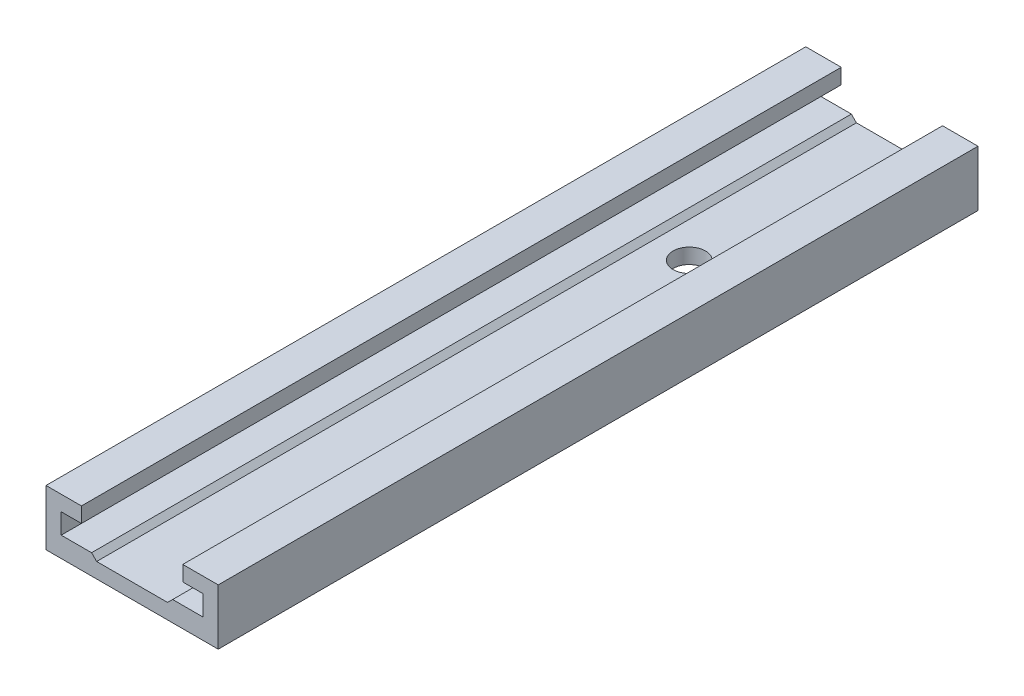
ISO-10303-21;
HEADER;
FILE_DESCRIPTION(('STEP AP214'),'2;1');
FILE_NAME('part.step','',(''),(''),'','','');
FILE_SCHEMA(('AUTOMOTIVE_DESIGN { 1 0 10303 214 1 1 1 1 }'));
ENDSEC;
DATA;
#1=APPLICATION_CONTEXT('core data for automotive mechanical design processes');
#2=APPLICATION_PROTOCOL_DEFINITION('international standard','automotive_design',2000,#1);
#3=PRODUCT_CONTEXT('',#1,'mechanical');
#4=PRODUCT('Part','Part','',(#3));
#5=PRODUCT_RELATED_PRODUCT_CATEGORY('part','',(#4));
#6=PRODUCT_DEFINITION_FORMATION('','',#4);
#7=PRODUCT_DEFINITION_CONTEXT('part definition',#1,'design');
#8=PRODUCT_DEFINITION('design','',#6,#7);
#9=PRODUCT_DEFINITION_SHAPE('','',#8);
#10=(LENGTH_UNIT() NAMED_UNIT(*) SI_UNIT(.MILLI.,.METRE.));
#11=(NAMED_UNIT(*) PLANE_ANGLE_UNIT() SI_UNIT($,.RADIAN.));
#12=(NAMED_UNIT(*) SI_UNIT($,.STERADIAN.) SOLID_ANGLE_UNIT());
#13=UNCERTAINTY_MEASURE_WITH_UNIT(LENGTH_MEASURE(1.E-05),#10,'distance_accuracy_value','');
#14=(GEOMETRIC_REPRESENTATION_CONTEXT(3) GLOBAL_UNCERTAINTY_ASSIGNED_CONTEXT((#13)) GLOBAL_UNIT_ASSIGNED_CONTEXT((#10,
#11,#12)) REPRESENTATION_CONTEXT('',''));
#15=CARTESIAN_POINT('',(0.,0.,0.));
#16=DIRECTION('',(0.,0.,1.));
#17=DIRECTION('',(1.,0.,0.));
#18=AXIS2_PLACEMENT_3D('',#15,#16,#17);
#19=CARTESIAN_POINT('',(-8.5,5.5,75.));
#20=DIRECTION('',(1.,0.,0.));
#21=DIRECTION('',(0.,0.,-1.));
#22=AXIS2_PLACEMENT_3D('',#19,#20,#21);
#23=PLANE('',#22);
#24=DIRECTION('',(0.,-1.,0.));
#25=VECTOR('',#24,1.);
#26=CARTESIAN_POINT('',(-8.5,5.5,0.));
#27=LINE('',#26,#25);
#28=CARTESIAN_POINT('',(-8.5,5.5,0.));
#29=VERTEX_POINT('',#28);
#30=CARTESIAN_POINT('',(-8.5,0.,0.));
#31=VERTEX_POINT('',#30);
#32=EDGE_CURVE('E177',#29,#31,#27,.T.);
#33=ORIENTED_EDGE('',*,*,#32,.T.);
#34=DIRECTION('',(0.,0.,-1.));
#35=VECTOR('',#34,1.);
#36=CARTESIAN_POINT('',(-8.5,0.,75.));
#37=LINE('',#36,#35);
#38=CARTESIAN_POINT('',(-8.5,0.,75.));
#39=VERTEX_POINT('',#38);
#40=EDGE_CURVE('E11',#39,#31,#37,.T.);
#41=ORIENTED_EDGE('',*,*,#40,.F.);
#42=DIRECTION('',(0.,-1.,0.));
#43=VECTOR('',#42,1.);
#44=CARTESIAN_POINT('',(-8.5,5.5,75.));
#45=LINE('',#44,#43);
#46=CARTESIAN_POINT('',(-8.5,5.5,75.));
#47=VERTEX_POINT('',#46);
#48=EDGE_CURVE('E208',#47,#39,#45,.T.);
#49=ORIENTED_EDGE('',*,*,#48,.F.);
#50=DIRECTION('',(0.,0.,-1.));
#51=VECTOR('',#50,1.);
#52=CARTESIAN_POINT('',(-8.5,5.5,75.));
#53=LINE('',#52,#51);
#54=EDGE_CURVE('E173',#47,#29,#53,.T.);
#55=ORIENTED_EDGE('',*,*,#54,.T.);
#56=EDGE_LOOP('',(#33,#41,#49,#55));
#57=FACE_BOUND('',#56,.T.);
#58=ADVANCED_FACE('F33',(#57),#23,.F.);
#59=CARTESIAN_POINT('',(-8.5,0.,75.));
#60=DIRECTION('',(0.,1.,0.));
#61=DIRECTION('',(0.,0.,1.));
#62=AXIS2_PLACEMENT_3D('',#59,#60,#61);
#63=PLANE('',#62);
#64=CARTESIAN_POINT('',(0.,0.,20.));
#65=DIRECTION('',(0.,1.,0.));
#66=DIRECTION('',(0.,0.,1.));
#67=AXIS2_PLACEMENT_3D('',#64,#65,#66);
#68=CIRCLE('',#67,1.6);
#69=CARTESIAN_POINT('',(0.,0.,21.6));
#70=VERTEX_POINT('',#69);
#71=EDGE_CURVE('E181',#70,#70,#68,.T.);
#72=ORIENTED_EDGE('',*,*,#71,.T.);
#73=EDGE_LOOP('',(#72));
#74=FACE_BOUND('',#73,.T.);
#75=DIRECTION('',(1.,0.,0.));
#76=VECTOR('',#75,1.);
#77=CARTESIAN_POINT('',(-8.5,0.,0.));
#78=LINE('',#77,#76);
#79=CARTESIAN_POINT('',(8.5,0.,0.));
#80=VERTEX_POINT('',#79);
#81=EDGE_CURVE('E180',#31,#80,#78,.T.);
#82=ORIENTED_EDGE('',*,*,#81,.T.);
#83=DIRECTION('',(0.,0.,-1.));
#84=VECTOR('',#83,1.);
#85=CARTESIAN_POINT('',(8.5,0.,75.));
#86=LINE('',#85,#84);
#87=CARTESIAN_POINT('',(8.5,0.,75.));
#88=VERTEX_POINT('',#87);
#89=EDGE_CURVE('E41',#88,#80,#86,.T.);
#90=ORIENTED_EDGE('',*,*,#89,.F.);
#91=DIRECTION('',(1.,0.,0.));
#92=VECTOR('',#91,1.);
#93=CARTESIAN_POINT('',(-8.5,0.,75.));
#94=LINE('',#93,#92);
#95=EDGE_CURVE('E116',#39,#88,#94,.T.);
#96=ORIENTED_EDGE('',*,*,#95,.F.);
#97=ORIENTED_EDGE('',*,*,#40,.T.);
#98=EDGE_LOOP('',(#82,#90,#96,#97));
#99=FACE_BOUND('',#98,.T.);
#100=ADVANCED_FACE('F306',(#74,#99),#63,.F.);
#101=CARTESIAN_POINT('',(8.5,0.,75.));
#102=DIRECTION('',(-1.,0.,0.));
#103=DIRECTION('',(0.,0.,1.));
#104=AXIS2_PLACEMENT_3D('',#101,#102,#103);
#105=PLANE('',#104);
#106=DIRECTION('',(0.,1.,0.));
#107=VECTOR('',#106,1.);
#108=CARTESIAN_POINT('',(8.5,0.,0.));
#109=LINE('',#108,#107);
#110=CARTESIAN_POINT('',(8.5,5.5,0.));
#111=VERTEX_POINT('',#110);
#112=EDGE_CURVE('E183',#80,#111,#109,.T.);
#113=ORIENTED_EDGE('',*,*,#112,.T.);
#114=DIRECTION('',(0.,0.,-1.));
#115=VECTOR('',#114,1.);
#116=CARTESIAN_POINT('',(8.5,5.5,75.));
#117=LINE('',#116,#115);
#118=CARTESIAN_POINT('',(8.5,5.5,75.));
#119=VERTEX_POINT('',#118);
#120=EDGE_CURVE('E239',#119,#111,#117,.T.);
#121=ORIENTED_EDGE('',*,*,#120,.F.);
#122=DIRECTION('',(0.,1.,0.));
#123=VECTOR('',#122,1.);
#124=CARTESIAN_POINT('',(8.5,0.,75.));
#125=LINE('',#124,#123);
#126=EDGE_CURVE('E247',#88,#119,#125,.T.);
#127=ORIENTED_EDGE('',*,*,#126,.F.);
#128=ORIENTED_EDGE('',*,*,#89,.T.);
#129=EDGE_LOOP('',(#113,#121,#127,#128));
#130=FACE_BOUND('',#129,.T.);
#131=ADVANCED_FACE('F245',(#130),#105,.F.);
#132=CARTESIAN_POINT('',(8.5,5.5,75.));
#133=DIRECTION('',(0.,-1.,0.));
#134=DIRECTION('',(0.,0.,-1.));
#135=AXIS2_PLACEMENT_3D('',#132,#133,#134);
#136=PLANE('',#135);
#137=DIRECTION('',(-1.,0.,0.));
#138=VECTOR('',#137,1.);
#139=CARTESIAN_POINT('',(8.5,5.5,0.));
#140=LINE('',#139,#138);
#141=CARTESIAN_POINT('',(5.,5.5,0.));
#142=VERTEX_POINT('',#141);
#143=EDGE_CURVE('E185',#111,#142,#140,.T.);
#144=ORIENTED_EDGE('',*,*,#143,.T.);
#145=DIRECTION('',(0.,0.,-1.));
#146=VECTOR('',#145,1.);
#147=CARTESIAN_POINT('',(5.,5.5,75.));
#148=LINE('',#147,#146);
#149=CARTESIAN_POINT('',(5.,5.5,75.));
#150=VERTEX_POINT('',#149);
#151=EDGE_CURVE('E236',#150,#142,#148,.T.);
#152=ORIENTED_EDGE('',*,*,#151,.F.);
#153=DIRECTION('',(-1.,0.,0.));
#154=VECTOR('',#153,1.);
#155=CARTESIAN_POINT('',(8.5,5.5,75.));
#156=LINE('',#155,#154);
#157=EDGE_CURVE('E265',#119,#150,#156,.T.);
#158=ORIENTED_EDGE('',*,*,#157,.F.);
#159=ORIENTED_EDGE('',*,*,#120,.T.);
#160=EDGE_LOOP('',(#144,#152,#158,#159));
#161=FACE_BOUND('',#160,.T.);
#162=ADVANCED_FACE('F256',(#161),#136,.F.);
#163=CARTESIAN_POINT('',(5.,5.5,75.));
#164=DIRECTION('',(1.,0.,0.));
#165=DIRECTION('',(0.,0.,-1.));
#166=AXIS2_PLACEMENT_3D('',#163,#164,#165);
#167=PLANE('',#166);
#168=DIRECTION('',(0.,-1.,0.));
#169=VECTOR('',#168,1.);
#170=CARTESIAN_POINT('',(5.,5.5,0.));
#171=LINE('',#170,#169);
#172=CARTESIAN_POINT('',(5.,4.,0.));
#173=VERTEX_POINT('',#172);
#174=EDGE_CURVE('E187',#142,#173,#171,.T.);
#175=ORIENTED_EDGE('',*,*,#174,.T.);
#176=DIRECTION('',(0.,0.,-1.));
#177=VECTOR('',#176,1.);
#178=CARTESIAN_POINT('',(5.,4.,75.));
#179=LINE('',#178,#177);
#180=CARTESIAN_POINT('',(5.,4.,75.));
#181=VERTEX_POINT('',#180);
#182=EDGE_CURVE('E233',#181,#173,#179,.T.);
#183=ORIENTED_EDGE('',*,*,#182,.F.);
#184=DIRECTION('',(0.,-1.,0.));
#185=VECTOR('',#184,1.);
#186=CARTESIAN_POINT('',(5.,5.5,75.));
#187=LINE('',#186,#185);
#188=EDGE_CURVE('E262',#150,#181,#187,.T.);
#189=ORIENTED_EDGE('',*,*,#188,.F.);
#190=ORIENTED_EDGE('',*,*,#151,.T.);
#191=EDGE_LOOP('',(#175,#183,#189,#190));
#192=FACE_BOUND('',#191,.T.);
#193=ADVANCED_FACE('F260',(#192),#167,.F.);
#194=CARTESIAN_POINT('',(5.,4.,75.));
#195=DIRECTION('',(0.,1.,0.));
#196=DIRECTION('',(0.,0.,1.));
#197=AXIS2_PLACEMENT_3D('',#194,#195,#196);
#198=PLANE('',#197);
#199=DIRECTION('',(1.,0.,0.));
#200=VECTOR('',#199,1.);
#201=CARTESIAN_POINT('',(5.,4.,0.));
#202=LINE('',#201,#200);
#203=CARTESIAN_POINT('',(7.,4.,0.));
#204=VERTEX_POINT('',#203);
#205=EDGE_CURVE('E189',#173,#204,#202,.T.);
#206=ORIENTED_EDGE('',*,*,#205,.T.);
#207=DIRECTION('',(0.,0.,-1.));
#208=VECTOR('',#207,1.);
#209=CARTESIAN_POINT('',(7.,4.,75.));
#210=LINE('',#209,#208);
#211=CARTESIAN_POINT('',(7.,4.,75.));
#212=VERTEX_POINT('',#211);
#213=EDGE_CURVE('E230',#212,#204,#210,.T.);
#214=ORIENTED_EDGE('',*,*,#213,.F.);
#215=DIRECTION('',(1.,0.,0.));
#216=VECTOR('',#215,1.);
#217=CARTESIAN_POINT('',(5.,4.,75.));
#218=LINE('',#217,#216);
#219=EDGE_CURVE('E264',#181,#212,#218,.T.);
#220=ORIENTED_EDGE('',*,*,#219,.F.);
#221=ORIENTED_EDGE('',*,*,#182,.T.);
#222=EDGE_LOOP('',(#206,#214,#220,#221));
#223=FACE_BOUND('',#222,.T.);
#224=ADVANCED_FACE('F321',(#223),#198,.F.);
#225=CARTESIAN_POINT('',(7.,4.,75.));
#226=DIRECTION('',(1.,0.,0.));
#227=DIRECTION('',(0.,0.,-1.));
#228=AXIS2_PLACEMENT_3D('',#225,#226,#227);
#229=PLANE('',#228);
#230=DIRECTION('',(0.,-1.,0.));
#231=VECTOR('',#230,1.);
#232=CARTESIAN_POINT('',(7.,4.,0.));
#233=LINE('',#232,#231);
#234=CARTESIAN_POINT('',(7.,2.,0.));
#235=VERTEX_POINT('',#234);
#236=EDGE_CURVE('E191',#204,#235,#233,.T.);
#237=ORIENTED_EDGE('',*,*,#236,.T.);
#238=DIRECTION('',(0.,0.,-1.));
#239=VECTOR('',#238,1.);
#240=CARTESIAN_POINT('',(7.,2.,75.));
#241=LINE('',#240,#239);
#242=CARTESIAN_POINT('',(7.,2.,75.));
#243=VERTEX_POINT('',#242);
#244=EDGE_CURVE('E227',#243,#235,#241,.T.);
#245=ORIENTED_EDGE('',*,*,#244,.F.);
#246=DIRECTION('',(0.,-1.,0.));
#247=VECTOR('',#246,1.);
#248=CARTESIAN_POINT('',(7.,4.,75.));
#249=LINE('',#248,#247);
#250=EDGE_CURVE('E267',#212,#243,#249,.T.);
#251=ORIENTED_EDGE('',*,*,#250,.F.);
#252=ORIENTED_EDGE('',*,*,#213,.T.);
#253=EDGE_LOOP('',(#237,#245,#251,#252));
#254=FACE_BOUND('',#253,.T.);
#255=ADVANCED_FACE('F324',(#254),#229,.F.);
#256=CARTESIAN_POINT('',(7.,2.,75.));
#257=DIRECTION('',(0.,-1.,0.));
#258=DIRECTION('',(1.,0.,0.));
#259=AXIS2_PLACEMENT_3D('',#256,#257,#258);
#260=PLANE('',#259);
#261=DIRECTION('',(-1.,0.,0.));
#262=VECTOR('',#261,1.);
#263=CARTESIAN_POINT('',(7.,2.,0.));
#264=LINE('',#263,#262);
#265=CARTESIAN_POINT('',(4.,2.,0.));
#266=VERTEX_POINT('',#265);
#267=EDGE_CURVE('E193',#235,#266,#264,.T.);
#268=ORIENTED_EDGE('',*,*,#267,.T.);
#269=DIRECTION('',(0.,0.,-1.));
#270=VECTOR('',#269,1.);
#271=CARTESIAN_POINT('',(4.,2.,75.));
#272=LINE('',#271,#270);
#273=CARTESIAN_POINT('',(4.,2.,75.));
#274=VERTEX_POINT('',#273);
#275=EDGE_CURVE('E224',#274,#266,#272,.T.);
#276=ORIENTED_EDGE('',*,*,#275,.F.);
#277=DIRECTION('',(-1.,0.,0.));
#278=VECTOR('',#277,1.);
#279=CARTESIAN_POINT('',(7.,2.,75.));
#280=LINE('',#279,#278);
#281=EDGE_CURVE('E273',#243,#274,#280,.T.);
#282=ORIENTED_EDGE('',*,*,#281,.F.);
#283=ORIENTED_EDGE('',*,*,#244,.T.);
#284=EDGE_LOOP('',(#268,#276,#282,#283));
#285=FACE_BOUND('',#284,.T.);
#286=ADVANCED_FACE('F328',(#285),#260,.F.);
#287=CARTESIAN_POINT('',(4.,2.,75.));
#288=DIRECTION('',(0.707106781186547,-0.707106781186548,0.));
#289=DIRECTION('',(0.707106781186548,0.707106781186547,0.));
#290=AXIS2_PLACEMENT_3D('',#287,#288,#289);
#291=PLANE('',#290);
#292=DIRECTION('',(-0.707106781186548,-0.707106781186547,0.));
#293=VECTOR('',#292,1.);
#294=CARTESIAN_POINT('',(4.,2.,0.));
#295=LINE('',#294,#293);
#296=CARTESIAN_POINT('',(3.5,1.5,0.));
#297=VERTEX_POINT('',#296);
#298=EDGE_CURVE('E195',#266,#297,#295,.T.);
#299=ORIENTED_EDGE('',*,*,#298,.T.);
#300=DIRECTION('',(0.,0.,-1.));
#301=VECTOR('',#300,1.);
#302=CARTESIAN_POINT('',(3.5,1.5,75.));
#303=LINE('',#302,#301);
#304=CARTESIAN_POINT('',(3.5,1.5,75.));
#305=VERTEX_POINT('',#304);
#306=EDGE_CURVE('E221',#305,#297,#303,.T.);
#307=ORIENTED_EDGE('',*,*,#306,.F.);
#308=DIRECTION('',(-0.707106781186548,-0.707106781186547,0.));
#309=VECTOR('',#308,1.);
#310=CARTESIAN_POINT('',(4.,2.,75.));
#311=LINE('',#310,#309);
#312=EDGE_CURVE('E275',#274,#305,#311,.T.);
#313=ORIENTED_EDGE('',*,*,#312,.F.);
#314=ORIENTED_EDGE('',*,*,#275,.T.);
#315=EDGE_LOOP('',(#299,#307,#313,#314));
#316=FACE_BOUND('',#315,.T.);
#317=ADVANCED_FACE('F332',(#316),#291,.F.);
#318=CARTESIAN_POINT('',(3.5,1.5,75.));
#319=DIRECTION('',(0.,-1.,0.));
#320=DIRECTION('',(0.,0.,-1.));
#321=AXIS2_PLACEMENT_3D('',#318,#319,#320);
#322=PLANE('',#321);
#323=CARTESIAN_POINT('',(0.,1.5,20.));
#324=DIRECTION('',(0.,1.,0.));
#325=DIRECTION('',(0.,0.,1.));
#326=AXIS2_PLACEMENT_3D('',#323,#324,#325);
#327=CIRCLE('',#326,1.59999999999999);
#328=CARTESIAN_POINT('',(0.,1.5,21.6));
#329=VERTEX_POINT('',#328);
#330=EDGE_CURVE('E407',#329,#329,#327,.T.);
#331=ORIENTED_EDGE('',*,*,#330,.F.);
#332=EDGE_LOOP('',(#331));
#333=FACE_BOUND('',#332,.T.);
#334=DIRECTION('',(-1.,0.,0.));
#335=VECTOR('',#334,1.);
#336=CARTESIAN_POINT('',(3.5,1.5,0.));
#337=LINE('',#336,#335);
#338=CARTESIAN_POINT('',(-3.5,1.5,0.));
#339=VERTEX_POINT('',#338);
#340=EDGE_CURVE('E197',#297,#339,#337,.T.);
#341=ORIENTED_EDGE('',*,*,#340,.T.);
#342=DIRECTION('',(0.,0.,-1.));
#343=VECTOR('',#342,1.);
#344=CARTESIAN_POINT('',(-3.5,1.5,75.));
#345=LINE('',#344,#343);
#346=CARTESIAN_POINT('',(-3.5,1.5,75.));
#347=VERTEX_POINT('',#346);
#348=EDGE_CURVE('E218',#347,#339,#345,.T.);
#349=ORIENTED_EDGE('',*,*,#348,.F.);
#350=DIRECTION('',(-1.,0.,0.));
#351=VECTOR('',#350,1.);
#352=CARTESIAN_POINT('',(3.5,1.5,75.));
#353=LINE('',#352,#351);
#354=EDGE_CURVE('E277',#305,#347,#353,.T.);
#355=ORIENTED_EDGE('',*,*,#354,.F.);
#356=ORIENTED_EDGE('',*,*,#306,.T.);
#357=EDGE_LOOP('',(#341,#349,#355,#356));
#358=FACE_BOUND('',#357,.T.);
#359=ADVANCED_FACE('F336',(#333,#358),#322,.F.);
#360=CARTESIAN_POINT('',(-3.5,1.5,75.));
#361=DIRECTION('',(-0.707106781186547,-0.707106781186548,0.));
#362=DIRECTION('',(0.707106781186548,-0.707106781186547,0.));
#363=AXIS2_PLACEMENT_3D('',#360,#361,#362);
#364=PLANE('',#363);
#365=DIRECTION('',(-0.707106781186548,0.707106781186547,0.));
#366=VECTOR('',#365,1.);
#367=CARTESIAN_POINT('',(-3.5,1.5,0.));
#368=LINE('',#367,#366);
#369=CARTESIAN_POINT('',(-4.,2.,0.));
#370=VERTEX_POINT('',#369);
#371=EDGE_CURVE('E199',#339,#370,#368,.T.);
#372=ORIENTED_EDGE('',*,*,#371,.T.);
#373=DIRECTION('',(0.,0.,-1.));
#374=VECTOR('',#373,1.);
#375=CARTESIAN_POINT('',(-4.,2.,75.));
#376=LINE('',#375,#374);
#377=CARTESIAN_POINT('',(-4.,2.,75.));
#378=VERTEX_POINT('',#377);
#379=EDGE_CURVE('E215',#378,#370,#376,.T.);
#380=ORIENTED_EDGE('',*,*,#379,.F.);
#381=DIRECTION('',(-0.707106781186548,0.707106781186547,0.));
#382=VECTOR('',#381,1.);
#383=CARTESIAN_POINT('',(-3.5,1.5,75.));
#384=LINE('',#383,#382);
#385=EDGE_CURVE('E279',#347,#378,#384,.T.);
#386=ORIENTED_EDGE('',*,*,#385,.F.);
#387=ORIENTED_EDGE('',*,*,#348,.T.);
#388=EDGE_LOOP('',(#372,#380,#386,#387));
#389=FACE_BOUND('',#388,.T.);
#390=ADVANCED_FACE('F340',(#389),#364,.F.);
#391=CARTESIAN_POINT('',(-4.,2.,75.));
#392=DIRECTION('',(0.,-1.,0.));
#393=DIRECTION('',(1.,0.,0.));
#394=AXIS2_PLACEMENT_3D('',#391,#392,#393);
#395=PLANE('',#394);
#396=DIRECTION('',(-1.,0.,0.));
#397=VECTOR('',#396,1.);
#398=CARTESIAN_POINT('',(-4.,2.,0.));
#399=LINE('',#398,#397);
#400=CARTESIAN_POINT('',(-7.,2.,0.));
#401=VERTEX_POINT('',#400);
#402=EDGE_CURVE('E201',#370,#401,#399,.T.);
#403=ORIENTED_EDGE('',*,*,#402,.T.);
#404=DIRECTION('',(0.,0.,-1.));
#405=VECTOR('',#404,1.);
#406=CARTESIAN_POINT('',(-7.,2.,75.));
#407=LINE('',#406,#405);
#408=CARTESIAN_POINT('',(-7.,2.,75.));
#409=VERTEX_POINT('',#408);
#410=EDGE_CURVE('E212',#409,#401,#407,.T.);
#411=ORIENTED_EDGE('',*,*,#410,.F.);
#412=DIRECTION('',(-1.,0.,0.));
#413=VECTOR('',#412,1.);
#414=CARTESIAN_POINT('',(-4.,2.,75.));
#415=LINE('',#414,#413);
#416=EDGE_CURVE('E281',#378,#409,#415,.T.);
#417=ORIENTED_EDGE('',*,*,#416,.F.);
#418=ORIENTED_EDGE('',*,*,#379,.T.);
#419=EDGE_LOOP('',(#403,#411,#417,#418));
#420=FACE_BOUND('',#419,.T.);
#421=ADVANCED_FACE('F287',(#420),#395,.F.);
#422=CARTESIAN_POINT('',(-7.,2.,75.));
#423=DIRECTION('',(-1.,0.,0.));
#424=DIRECTION('',(0.,0.,1.));
#425=AXIS2_PLACEMENT_3D('',#422,#423,#424);
#426=PLANE('',#425);
#427=DIRECTION('',(0.,1.,0.));
#428=VECTOR('',#427,1.);
#429=CARTESIAN_POINT('',(-7.,2.,0.));
#430=LINE('',#429,#428);
#431=CARTESIAN_POINT('',(-7.,4.,0.));
#432=VERTEX_POINT('',#431);
#433=EDGE_CURVE('E203',#401,#432,#430,.T.);
#434=ORIENTED_EDGE('',*,*,#433,.T.);
#435=DIRECTION('',(0.,0.,-1.));
#436=VECTOR('',#435,1.);
#437=CARTESIAN_POINT('',(-7.,4.,75.));
#438=LINE('',#437,#436);
#439=CARTESIAN_POINT('',(-7.,4.,75.));
#440=VERTEX_POINT('',#439);
#441=EDGE_CURVE('E168',#440,#432,#438,.T.);
#442=ORIENTED_EDGE('',*,*,#441,.F.);
#443=DIRECTION('',(0.,1.,0.));
#444=VECTOR('',#443,1.);
#445=CARTESIAN_POINT('',(-7.,2.,75.));
#446=LINE('',#445,#444);
#447=EDGE_CURVE('E159',#409,#440,#446,.T.);
#448=ORIENTED_EDGE('',*,*,#447,.F.);
#449=ORIENTED_EDGE('',*,*,#410,.T.);
#450=EDGE_LOOP('',(#434,#442,#448,#449));
#451=FACE_BOUND('',#450,.T.);
#452=ADVANCED_FACE('F291',(#451),#426,.F.);
#453=CARTESIAN_POINT('',(-7.,4.,75.));
#454=DIRECTION('',(0.,1.,0.));
#455=DIRECTION('',(0.,0.,1.));
#456=AXIS2_PLACEMENT_3D('',#453,#454,#455);
#457=PLANE('',#456);
#458=DIRECTION('',(1.,0.,0.));
#459=VECTOR('',#458,1.);
#460=CARTESIAN_POINT('',(-7.,4.,0.));
#461=LINE('',#460,#459);
#462=CARTESIAN_POINT('',(-5.,4.,0.));
#463=VERTEX_POINT('',#462);
#464=EDGE_CURVE('E167',#432,#463,#461,.T.);
#465=ORIENTED_EDGE('',*,*,#464,.T.);
#466=DIRECTION('',(0.,0.,-1.));
#467=VECTOR('',#466,1.);
#468=CARTESIAN_POINT('',(-5.,4.,75.));
#469=LINE('',#468,#467);
#470=CARTESIAN_POINT('',(-5.,4.,75.));
#471=VERTEX_POINT('',#470);
#472=EDGE_CURVE('E164',#471,#463,#469,.T.);
#473=ORIENTED_EDGE('',*,*,#472,.F.);
#474=DIRECTION('',(1.,0.,0.));
#475=VECTOR('',#474,1.);
#476=CARTESIAN_POINT('',(-7.,4.,75.));
#477=LINE('',#476,#475);
#478=EDGE_CURVE('E153',#440,#471,#477,.T.);
#479=ORIENTED_EDGE('',*,*,#478,.F.);
#480=ORIENTED_EDGE('',*,*,#441,.T.);
#481=EDGE_LOOP('',(#465,#473,#479,#480));
#482=FACE_BOUND('',#481,.T.);
#483=ADVANCED_FACE('F165',(#482),#457,.F.);
#484=CARTESIAN_POINT('',(-5.,4.,75.));
#485=DIRECTION('',(-1.,0.,0.));
#486=DIRECTION('',(0.,0.,1.));
#487=AXIS2_PLACEMENT_3D('',#484,#485,#486);
#488=PLANE('',#487);
#489=DIRECTION('',(0.,1.,0.));
#490=VECTOR('',#489,1.);
#491=CARTESIAN_POINT('',(-5.,4.,0.));
#492=LINE('',#491,#490);
#493=CARTESIAN_POINT('',(-5.,5.5,0.));
#494=VERTEX_POINT('',#493);
#495=EDGE_CURVE('E102',#463,#494,#492,.T.);
#496=ORIENTED_EDGE('',*,*,#495,.T.);
#497=DIRECTION('',(0.,0.,-1.));
#498=VECTOR('',#497,1.);
#499=CARTESIAN_POINT('',(-5.,5.5,75.));
#500=LINE('',#499,#498);
#501=CARTESIAN_POINT('',(-5.,5.5,75.));
#502=VERTEX_POINT('',#501);
#503=EDGE_CURVE('E169',#502,#494,#500,.T.);
#504=ORIENTED_EDGE('',*,*,#503,.F.);
#505=DIRECTION('',(0.,1.,0.));
#506=VECTOR('',#505,1.);
#507=CARTESIAN_POINT('',(-5.,4.,75.));
#508=LINE('',#507,#506);
#509=EDGE_CURVE('E157',#471,#502,#508,.T.);
#510=ORIENTED_EDGE('',*,*,#509,.F.);
#511=ORIENTED_EDGE('',*,*,#472,.T.);
#512=EDGE_LOOP('',(#496,#504,#510,#511));
#513=FACE_BOUND('',#512,.T.);
#514=ADVANCED_FACE('F171',(#513),#488,.F.);
#515=CARTESIAN_POINT('',(-5.,5.5,75.));
#516=DIRECTION('',(0.,-1.,0.));
#517=DIRECTION('',(0.,0.,-1.));
#518=AXIS2_PLACEMENT_3D('',#515,#516,#517);
#519=PLANE('',#518);
#520=DIRECTION('',(-1.,0.,0.));
#521=VECTOR('',#520,1.);
#522=CARTESIAN_POINT('',(-5.,5.5,0.));
#523=LINE('',#522,#521);
#524=EDGE_CURVE('E108',#494,#29,#523,.T.);
#525=ORIENTED_EDGE('',*,*,#524,.T.);
#526=ORIENTED_EDGE('',*,*,#54,.F.);
#527=DIRECTION('',(-1.,0.,0.));
#528=VECTOR('',#527,1.);
#529=CARTESIAN_POINT('',(-5.,5.5,75.));
#530=LINE('',#529,#528);
#531=EDGE_CURVE('E49',#502,#47,#530,.T.);
#532=ORIENTED_EDGE('',*,*,#531,.F.);
#533=ORIENTED_EDGE('',*,*,#503,.T.);
#534=EDGE_LOOP('',(#525,#526,#532,#533));
#535=FACE_BOUND('',#534,.T.);
#536=ADVANCED_FACE('F295',(#535),#519,.F.);
#537=CARTESIAN_POINT('',(0.,0.,75.));
#538=DIRECTION('',(0.,0.,1.));
#539=DIRECTION('',(1.,0.,0.));
#540=AXIS2_PLACEMENT_3D('',#537,#538,#539);
#541=PLANE('',#540);
#542=ORIENTED_EDGE('',*,*,#48,.T.);
#543=ORIENTED_EDGE('',*,*,#95,.T.);
#544=ORIENTED_EDGE('',*,*,#126,.T.);
#545=ORIENTED_EDGE('',*,*,#157,.T.);
#546=ORIENTED_EDGE('',*,*,#188,.T.);
#547=ORIENTED_EDGE('',*,*,#219,.T.);
#548=ORIENTED_EDGE('',*,*,#250,.T.);
#549=ORIENTED_EDGE('',*,*,#281,.T.);
#550=ORIENTED_EDGE('',*,*,#312,.T.);
#551=ORIENTED_EDGE('',*,*,#354,.T.);
#552=ORIENTED_EDGE('',*,*,#385,.T.);
#553=ORIENTED_EDGE('',*,*,#416,.T.);
#554=ORIENTED_EDGE('',*,*,#447,.T.);
#555=ORIENTED_EDGE('',*,*,#478,.T.);
#556=ORIENTED_EDGE('',*,*,#509,.T.);
#557=ORIENTED_EDGE('',*,*,#531,.T.);
#558=EDGE_LOOP('',(#542,#543,#544,#545,#546,#547,#548,#549,#550,#551,#552,#553,#554,#555,#556,#557));
#559=FACE_BOUND('',#558,.T.);
#560=ADVANCED_FACE('F155',(#559),#541,.T.);
#561=CARTESIAN_POINT('',(0.,0.,0.));
#562=DIRECTION('',(0.,0.,1.));
#563=DIRECTION('',(1.,0.,0.));
#564=AXIS2_PLACEMENT_3D('',#561,#562,#563);
#565=PLANE('',#564);
#566=ORIENTED_EDGE('',*,*,#32,.F.);
#567=ORIENTED_EDGE('',*,*,#524,.F.);
#568=ORIENTED_EDGE('',*,*,#495,.F.);
#569=ORIENTED_EDGE('',*,*,#464,.F.);
#570=ORIENTED_EDGE('',*,*,#433,.F.);
#571=ORIENTED_EDGE('',*,*,#402,.F.);
#572=ORIENTED_EDGE('',*,*,#371,.F.);
#573=ORIENTED_EDGE('',*,*,#340,.F.);
#574=ORIENTED_EDGE('',*,*,#298,.F.);
#575=ORIENTED_EDGE('',*,*,#267,.F.);
#576=ORIENTED_EDGE('',*,*,#236,.F.);
#577=ORIENTED_EDGE('',*,*,#205,.F.);
#578=ORIENTED_EDGE('',*,*,#174,.F.);
#579=ORIENTED_EDGE('',*,*,#143,.F.);
#580=ORIENTED_EDGE('',*,*,#112,.F.);
#581=ORIENTED_EDGE('',*,*,#81,.F.);
#582=EDGE_LOOP('',(#566,#567,#568,#569,#570,#571,#572,#573,#574,#575,#576,#577,#578,#579,#580,#581));
#583=FACE_BOUND('',#582,.T.);
#584=ADVANCED_FACE('F251',(#583),#565,.F.);
#585=CARTESIAN_POINT('',(0.,1.5,20.));
#586=DIRECTION('',(0.,1.,0.));
#587=DIRECTION('',(0.,0.,1.));
#588=AXIS2_PLACEMENT_3D('',#585,#586,#587);
#589=CYLINDRICAL_SURFACE('',#588,1.59999999999999);
#590=ORIENTED_EDGE('',*,*,#71,.F.);
#591=EDGE_LOOP('',(#590));
#592=FACE_BOUND('',#591,.T.);
#593=ORIENTED_EDGE('',*,*,#330,.T.);
#594=EDGE_LOOP('',(#593));
#595=FACE_BOUND('',#594,.T.);
#596=ADVANCED_FACE('F376',(#592,#595),#589,.F.);
#597=CLOSED_SHELL('',(#58,#100,#131,#162,#193,#224,#255,#286,#317,#359,#390,#421,#452,#483,#514,
#536,#560,#584,#596));
#598=MANIFOLD_SOLID_BREP('B2',#597);
#599=ADVANCED_BREP_SHAPE_REPRESENTATION('',(#18,#598),#14);
#600=SHAPE_DEFINITION_REPRESENTATION(#9,#599);
ENDSEC;
END-ISO-10303-21;
